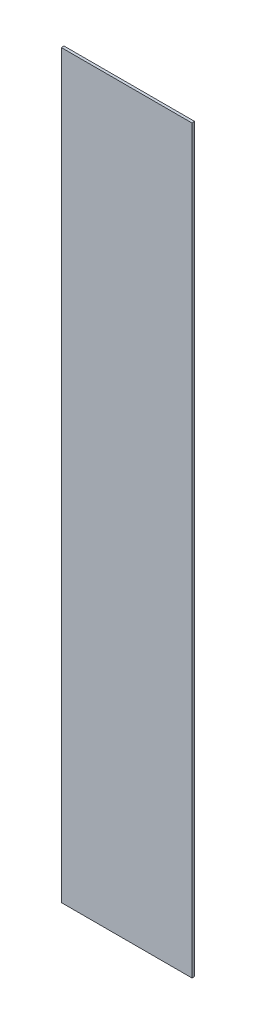
ISO-10303-21;
HEADER;
FILE_DESCRIPTION(('STEP AP214'),'2;1');
FILE_NAME('part.step','',(''),(''),'','','');
FILE_SCHEMA(('AUTOMOTIVE_DESIGN { 1 0 10303 214 1 1 1 1 }'));
ENDSEC;
DATA;
#1=APPLICATION_CONTEXT('core data for automotive mechanical design processes');
#2=APPLICATION_PROTOCOL_DEFINITION('international standard','automotive_design',2000,#1);
#3=PRODUCT_CONTEXT('',#1,'mechanical');
#4=PRODUCT('Part','Part','',(#3));
#5=PRODUCT_RELATED_PRODUCT_CATEGORY('part','',(#4));
#6=PRODUCT_DEFINITION_FORMATION('','',#4);
#7=PRODUCT_DEFINITION_CONTEXT('part definition',#1,'design');
#8=PRODUCT_DEFINITION('design','',#6,#7);
#9=PRODUCT_DEFINITION_SHAPE('','',#8);
#10=(LENGTH_UNIT() NAMED_UNIT(*) SI_UNIT(.MILLI.,.METRE.));
#11=(NAMED_UNIT(*) PLANE_ANGLE_UNIT() SI_UNIT($,.RADIAN.));
#12=(NAMED_UNIT(*) SI_UNIT($,.STERADIAN.) SOLID_ANGLE_UNIT());
#13=UNCERTAINTY_MEASURE_WITH_UNIT(LENGTH_MEASURE(1.E-05),#10,'distance_accuracy_value','');
#14=(GEOMETRIC_REPRESENTATION_CONTEXT(3) GLOBAL_UNCERTAINTY_ASSIGNED_CONTEXT((#13)) GLOBAL_UNIT_ASSIGNED_CONTEXT((#10,
#11,#12)) REPRESENTATION_CONTEXT('',''));
#15=CARTESIAN_POINT('',(0.,0.,0.));
#16=DIRECTION('',(0.,0.,1.));
#17=DIRECTION('',(1.,0.,0.));
#18=AXIS2_PLACEMENT_3D('',#15,#16,#17);
#19=CARTESIAN_POINT('',(-48.5,-275.,1.));
#20=DIRECTION('',(1.,0.,0.));
#21=DIRECTION('',(0.,0.,-1.));
#22=AXIS2_PLACEMENT_3D('',#19,#20,#21);
#23=PLANE('',#22);
#24=DIRECTION('',(0.,-1.,0.));
#25=VECTOR('',#24,1.);
#26=CARTESIAN_POINT('',(-48.5,-275.,-1.));
#27=LINE('',#26,#25);
#28=CARTESIAN_POINT('',(-48.5,275.,-1.));
#29=VERTEX_POINT('',#28);
#30=CARTESIAN_POINT('',(-48.5,-275.,-1.));
#31=VERTEX_POINT('',#30);
#32=EDGE_CURVE('E100',#29,#31,#27,.T.);
#33=ORIENTED_EDGE('',*,*,#32,.T.);
#34=DIRECTION('',(0.,0.,-1.));
#35=VECTOR('',#34,1.);
#36=CARTESIAN_POINT('',(-48.5,-275.,1.));
#37=LINE('',#36,#35);
#38=CARTESIAN_POINT('',(-48.5,-275.,1.));
#39=VERTEX_POINT('',#38);
#40=EDGE_CURVE('E11',#39,#31,#37,.T.);
#41=ORIENTED_EDGE('',*,*,#40,.F.);
#42=DIRECTION('',(0.,-1.,0.));
#43=VECTOR('',#42,1.);
#44=CARTESIAN_POINT('',(-48.5,-275.,1.));
#45=LINE('',#44,#43);
#46=CARTESIAN_POINT('',(-48.5,275.,1.));
#47=VERTEX_POINT('',#46);
#48=EDGE_CURVE('E88',#47,#39,#45,.T.);
#49=ORIENTED_EDGE('',*,*,#48,.F.);
#50=DIRECTION('',(0.,0.,-1.));
#51=VECTOR('',#50,1.);
#52=CARTESIAN_POINT('',(-48.5,275.,1.));
#53=LINE('',#52,#51);
#54=EDGE_CURVE('E96',#47,#29,#53,.T.);
#55=ORIENTED_EDGE('',*,*,#54,.T.);
#56=EDGE_LOOP('',(#33,#41,#49,#55));
#57=FACE_BOUND('',#56,.T.);
#58=ADVANCED_FACE('F37',(#57),#23,.F.);
#59=CARTESIAN_POINT('',(48.5,-275.,1.));
#60=DIRECTION('',(0.,1.,0.));
#61=DIRECTION('',(0.,0.,1.));
#62=AXIS2_PLACEMENT_3D('',#59,#60,#61);
#63=PLANE('',#62);
#64=DIRECTION('',(1.,0.,0.));
#65=VECTOR('',#64,1.);
#66=CARTESIAN_POINT('',(48.5,-275.,-1.));
#67=LINE('',#66,#65);
#68=CARTESIAN_POINT('',(48.5,-275.,-1.));
#69=VERTEX_POINT('',#68);
#70=EDGE_CURVE('E92',#31,#69,#67,.T.);
#71=ORIENTED_EDGE('',*,*,#70,.T.);
#72=DIRECTION('',(0.,0.,-1.));
#73=VECTOR('',#72,1.);
#74=CARTESIAN_POINT('',(48.5,-275.,1.));
#75=LINE('',#74,#73);
#76=CARTESIAN_POINT('',(48.5,-275.,1.));
#77=VERTEX_POINT('',#76);
#78=EDGE_CURVE('E45',#77,#69,#75,.T.);
#79=ORIENTED_EDGE('',*,*,#78,.F.);
#80=DIRECTION('',(1.,0.,0.));
#81=VECTOR('',#80,1.);
#82=CARTESIAN_POINT('',(48.5,-275.,1.));
#83=LINE('',#82,#81);
#84=EDGE_CURVE('E83',#39,#77,#83,.T.);
#85=ORIENTED_EDGE('',*,*,#84,.F.);
#86=ORIENTED_EDGE('',*,*,#40,.T.);
#87=EDGE_LOOP('',(#71,#79,#85,#86));
#88=FACE_BOUND('',#87,.T.);
#89=ADVANCED_FACE('F91',(#88),#63,.F.);
#90=CARTESIAN_POINT('',(48.5,-275.,1.));
#91=DIRECTION('',(-1.,0.,0.));
#92=DIRECTION('',(0.,0.,1.));
#93=AXIS2_PLACEMENT_3D('',#90,#91,#92);
#94=PLANE('',#93);
#95=DIRECTION('',(0.,1.,0.));
#96=VECTOR('',#95,1.);
#97=CARTESIAN_POINT('',(48.5,-275.,-1.));
#98=LINE('',#97,#96);
#99=CARTESIAN_POINT('',(48.5,275.,-1.));
#100=VERTEX_POINT('',#99);
#101=EDGE_CURVE('E70',#69,#100,#98,.T.);
#102=ORIENTED_EDGE('',*,*,#101,.T.);
#103=DIRECTION('',(0.,0.,-1.));
#104=VECTOR('',#103,1.);
#105=CARTESIAN_POINT('',(48.5,275.,1.));
#106=LINE('',#105,#104);
#107=CARTESIAN_POINT('',(48.5,275.,1.));
#108=VERTEX_POINT('',#107);
#109=EDGE_CURVE('E93',#108,#100,#106,.T.);
#110=ORIENTED_EDGE('',*,*,#109,.F.);
#111=DIRECTION('',(0.,1.,0.));
#112=VECTOR('',#111,1.);
#113=CARTESIAN_POINT('',(48.5,-275.,1.));
#114=LINE('',#113,#112);
#115=EDGE_CURVE('E86',#77,#108,#114,.T.);
#116=ORIENTED_EDGE('',*,*,#115,.F.);
#117=ORIENTED_EDGE('',*,*,#78,.T.);
#118=EDGE_LOOP('',(#102,#110,#116,#117));
#119=FACE_BOUND('',#118,.T.);
#120=ADVANCED_FACE('F94',(#119),#94,.F.);
#121=CARTESIAN_POINT('',(48.5,275.,1.));
#122=DIRECTION('',(0.,-1.,0.));
#123=DIRECTION('',(1.,0.,0.));
#124=AXIS2_PLACEMENT_3D('',#121,#122,#123);
#125=PLANE('',#124);
#126=DIRECTION('',(-1.,0.,0.));
#127=VECTOR('',#126,1.);
#128=CARTESIAN_POINT('',(48.5,275.,-1.));
#129=LINE('',#128,#127);
#130=EDGE_CURVE('E76',#100,#29,#129,.T.);
#131=ORIENTED_EDGE('',*,*,#130,.T.);
#132=ORIENTED_EDGE('',*,*,#54,.F.);
#133=DIRECTION('',(-1.,0.,0.));
#134=VECTOR('',#133,1.);
#135=CARTESIAN_POINT('',(48.5,275.,1.));
#136=LINE('',#135,#134);
#137=EDGE_CURVE('E53',#108,#47,#136,.T.);
#138=ORIENTED_EDGE('',*,*,#137,.F.);
#139=ORIENTED_EDGE('',*,*,#109,.T.);
#140=EDGE_LOOP('',(#131,#132,#138,#139));
#141=FACE_BOUND('',#140,.T.);
#142=ADVANCED_FACE('F107',(#141),#125,.F.);
#143=CARTESIAN_POINT('',(0.,0.,1.));
#144=DIRECTION('',(0.,0.,1.));
#145=DIRECTION('',(1.,0.,0.));
#146=AXIS2_PLACEMENT_3D('',#143,#144,#145);
#147=PLANE('',#146);
#148=ORIENTED_EDGE('',*,*,#48,.T.);
#149=ORIENTED_EDGE('',*,*,#84,.T.);
#150=ORIENTED_EDGE('',*,*,#115,.T.);
#151=ORIENTED_EDGE('',*,*,#137,.T.);
#152=EDGE_LOOP('',(#148,#149,#150,#151));
#153=FACE_BOUND('',#152,.T.);
#154=ADVANCED_FACE('F84',(#153),#147,.T.);
#155=CARTESIAN_POINT('',(0.,0.,-1.));
#156=DIRECTION('',(0.,0.,1.));
#157=DIRECTION('',(1.,0.,0.));
#158=AXIS2_PLACEMENT_3D('',#155,#156,#157);
#159=PLANE('',#158);
#160=ORIENTED_EDGE('',*,*,#32,.F.);
#161=ORIENTED_EDGE('',*,*,#130,.F.);
#162=ORIENTED_EDGE('',*,*,#101,.F.);
#163=ORIENTED_EDGE('',*,*,#70,.F.);
#164=EDGE_LOOP('',(#160,#161,#162,#163));
#165=FACE_BOUND('',#164,.T.);
#166=ADVANCED_FACE('F110',(#165),#159,.F.);
#167=CLOSED_SHELL('',(#58,#89,#120,#142,#154,#166));
#168=MANIFOLD_SOLID_BREP('B2',#167);
#169=ADVANCED_BREP_SHAPE_REPRESENTATION('',(#18,#168),#14);
#170=SHAPE_DEFINITION_REPRESENTATION(#9,#169);
ENDSEC;
END-ISO-10303-21;
